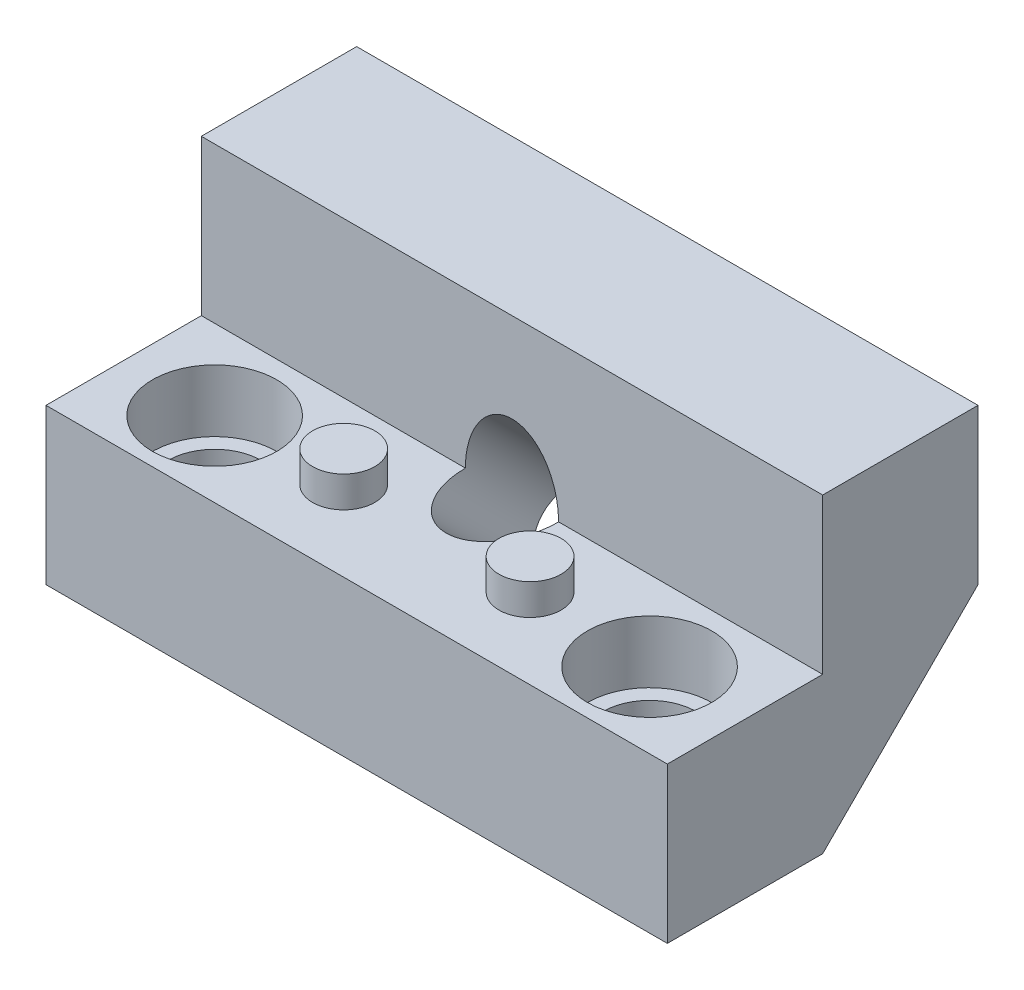
ISO-10303-21;
HEADER;
FILE_DESCRIPTION(('STEP AP214'),'2;1');
FILE_NAME('part.step','',(''),(''),'','','');
FILE_SCHEMA(('AUTOMOTIVE_DESIGN { 1 0 10303 214 1 1 1 1 }'));
ENDSEC;
DATA;
#1=APPLICATION_CONTEXT('core data for automotive mechanical design processes');
#2=APPLICATION_PROTOCOL_DEFINITION('international standard','automotive_design',2000,#1);
#3=PRODUCT_CONTEXT('',#1,'mechanical');
#4=PRODUCT('Part','Part','',(#3));
#5=PRODUCT_RELATED_PRODUCT_CATEGORY('part','',(#4));
#6=PRODUCT_DEFINITION_FORMATION('','',#4);
#7=PRODUCT_DEFINITION_CONTEXT('part definition',#1,'design');
#8=PRODUCT_DEFINITION('design','',#6,#7);
#9=PRODUCT_DEFINITION_SHAPE('','',#8);
#10=(LENGTH_UNIT() NAMED_UNIT(*) SI_UNIT(.MILLI.,.METRE.));
#11=(NAMED_UNIT(*) PLANE_ANGLE_UNIT() SI_UNIT($,.RADIAN.));
#12=(NAMED_UNIT(*) SI_UNIT($,.STERADIAN.) SOLID_ANGLE_UNIT());
#13=UNCERTAINTY_MEASURE_WITH_UNIT(LENGTH_MEASURE(1.E-05),#10,'distance_accuracy_value','');
#14=(GEOMETRIC_REPRESENTATION_CONTEXT(3) GLOBAL_UNCERTAINTY_ASSIGNED_CONTEXT((#13)) GLOBAL_UNIT_ASSIGNED_CONTEXT((#10,
#11,#12)) REPRESENTATION_CONTEXT('',''));
#15=CARTESIAN_POINT('',(0.,0.,0.));
#16=DIRECTION('',(0.,0.,1.));
#17=DIRECTION('',(1.,0.,0.));
#18=AXIS2_PLACEMENT_3D('',#15,#16,#17);
#19=CARTESIAN_POINT('',(-127.,127.,-63.5));
#20=DIRECTION('',(0.,0.,-1.));
#21=DIRECTION('',(-1.,0.,0.));
#22=AXIS2_PLACEMENT_3D('',#19,#20,#21);
#23=PLANE('',#22);
#24=DIRECTION('',(0.,-1.,0.));
#25=VECTOR('',#24,1.);
#26=CARTESIAN_POINT('',(127.,127.,-63.5));
#27=LINE('',#26,#25);
#28=CARTESIAN_POINT('',(127.,127.,-63.5));
#29=VERTEX_POINT('',#28);
#30=CARTESIAN_POINT('',(127.,63.5,-63.5));
#31=VERTEX_POINT('',#30);
#32=EDGE_CURVE('E136',#29,#31,#27,.T.);
#33=ORIENTED_EDGE('',*,*,#32,.T.);
#34=DIRECTION('',(-1.,0.,0.));
#35=VECTOR('',#34,1.);
#36=CARTESIAN_POINT('',(833.35649666683,63.5,-63.5));
#37=LINE('',#36,#35);
#38=CARTESIAN_POINT('',(-127.,63.5,-63.5));
#39=VERTEX_POINT('',#38);
#40=EDGE_CURVE('E54',#31,#39,#37,.T.);
#41=ORIENTED_EDGE('',*,*,#40,.T.);
#42=DIRECTION('',(0.,-1.,0.));
#43=VECTOR('',#42,1.);
#44=CARTESIAN_POINT('',(-127.,127.,-63.5));
#45=LINE('',#44,#43);
#46=CARTESIAN_POINT('',(-127.,127.,-63.5));
#47=VERTEX_POINT('',#46);
#48=EDGE_CURVE('E144',#47,#39,#45,.T.);
#49=ORIENTED_EDGE('',*,*,#48,.F.);
#50=DIRECTION('',(1.,0.,0.));
#51=VECTOR('',#50,1.);
#52=CARTESIAN_POINT('',(-127.,127.,-63.5));
#53=LINE('',#52,#51);
#54=EDGE_CURVE('E128',#47,#29,#53,.T.);
#55=ORIENTED_EDGE('',*,*,#54,.T.);
#56=EDGE_LOOP('',(#33,#41,#49,#55));
#57=FACE_BOUND('',#56,.T.);
#58=ADVANCED_FACE('F33',(#57),#23,.T.);
#59=CARTESIAN_POINT('',(0.,0.,0.));
#60=DIRECTION('',(0.,1.,0.));
#61=DIRECTION('',(0.,0.,1.));
#62=AXIS2_PLACEMENT_3D('',#59,#60,#61);
#63=PLANE('',#62);
#64=CARTESIAN_POINT('',(-88.9000000000001,0.,32.6581183731783));
#65=DIRECTION('',(0.,1.,0.));
#66=DIRECTION('',(0.,0.,1.));
#67=AXIS2_PLACEMENT_3D('',#64,#65,#66);
#68=CIRCLE('',#67,19.05);
#69=CARTESIAN_POINT('',(-88.9000000000001,0.,51.7081183731783));
#70=VERTEX_POINT('',#69);
#71=EDGE_CURVE('E179',#70,#70,#68,.T.);
#72=ORIENTED_EDGE('',*,*,#71,.T.);
#73=EDGE_LOOP('',(#72));
#74=FACE_BOUND('',#73,.T.);
#75=CARTESIAN_POINT('',(88.9,0.,32.6581183731783));
#76=DIRECTION('',(0.,1.,0.));
#77=DIRECTION('',(0.,0.,1.));
#78=AXIS2_PLACEMENT_3D('',#75,#76,#77);
#79=CIRCLE('',#78,19.05);
#80=CARTESIAN_POINT('',(88.9,0.,51.7081183731783));
#81=VERTEX_POINT('',#80);
#82=EDGE_CURVE('E187',#81,#81,#79,.T.);
#83=ORIENTED_EDGE('',*,*,#82,.T.);
#84=EDGE_LOOP('',(#83));
#85=FACE_BOUND('',#84,.T.);
#86=DIRECTION('',(-1.,0.,0.));
#87=VECTOR('',#86,1.);
#88=CARTESIAN_POINT('',(833.35649666683,0.,0.));
#89=LINE('',#88,#87);
#90=CARTESIAN_POINT('',(127.,0.,0.));
#91=VERTEX_POINT('',#90);
#92=CARTESIAN_POINT('',(-127.,0.,0.));
#93=VERTEX_POINT('',#92);
#94=EDGE_CURVE('E170',#91,#93,#89,.T.);
#95=ORIENTED_EDGE('',*,*,#94,.F.);
#96=DIRECTION('',(0.,0.,-1.));
#97=VECTOR('',#96,1.);
#98=CARTESIAN_POINT('',(127.,0.,63.5));
#99=LINE('',#98,#97);
#100=CARTESIAN_POINT('',(127.,0.,63.5));
#101=VERTEX_POINT('',#100);
#102=EDGE_CURVE('E127',#101,#91,#99,.T.);
#103=ORIENTED_EDGE('',*,*,#102,.F.);
#104=DIRECTION('',(1.,0.,0.));
#105=VECTOR('',#104,1.);
#106=CARTESIAN_POINT('',(-127.,0.,63.5));
#107=LINE('',#106,#105);
#108=CARTESIAN_POINT('',(-127.,0.,63.5));
#109=VERTEX_POINT('',#108);
#110=EDGE_CURVE('E139',#109,#101,#107,.T.);
#111=ORIENTED_EDGE('',*,*,#110,.F.);
#112=DIRECTION('',(0.,0.,-1.));
#113=VECTOR('',#112,1.);
#114=CARTESIAN_POINT('',(-127.,0.,63.5));
#115=LINE('',#114,#113);
#116=EDGE_CURVE('E132',#109,#93,#115,.T.);
#117=ORIENTED_EDGE('',*,*,#116,.T.);
#118=EDGE_LOOP('',(#95,#103,#111,#117));
#119=FACE_BOUND('',#118,.T.);
#120=ADVANCED_FACE('F222',(#74,#85,#119),#63,.F.);
#121=CARTESIAN_POINT('',(-127.,127.,63.5));
#122=DIRECTION('',(-1.,0.,0.));
#123=DIRECTION('',(0.,0.,1.));
#124=AXIS2_PLACEMENT_3D('',#121,#122,#123);
#125=PLANE('',#124);
#126=DIRECTION('',(0.,0.707106781186548,-0.707106781186547));
#127=VECTOR('',#126,1.);
#128=CARTESIAN_POINT('',(-127.,31.75,-31.75));
#129=LINE('',#128,#127);
#130=EDGE_CURVE('E116',#93,#39,#129,.T.);
#131=ORIENTED_EDGE('',*,*,#130,.F.);
#132=ORIENTED_EDGE('',*,*,#116,.F.);
#133=DIRECTION('',(0.,-1.,0.));
#134=VECTOR('',#133,1.);
#135=CARTESIAN_POINT('',(-127.,127.,63.5));
#136=LINE('',#135,#134);
#137=CARTESIAN_POINT('',(-127.,63.5,63.5));
#138=VERTEX_POINT('',#137);
#139=EDGE_CURVE('E148',#138,#109,#136,.T.);
#140=ORIENTED_EDGE('',*,*,#139,.F.);
#141=DIRECTION('',(0.,0.,-1.));
#142=VECTOR('',#141,1.);
#143=CARTESIAN_POINT('',(-127.,63.5,63.5));
#144=LINE('',#143,#142);
#145=CARTESIAN_POINT('',(-127.,63.5,0.));
#146=VERTEX_POINT('',#145);
#147=EDGE_CURVE('E125',#138,#146,#144,.T.);
#148=ORIENTED_EDGE('',*,*,#147,.T.);
#149=DIRECTION('',(0.,1.,0.));
#150=VECTOR('',#149,1.);
#151=CARTESIAN_POINT('',(-127.,127.,0.));
#152=LINE('',#151,#150);
#153=CARTESIAN_POINT('',(-127.,127.,0.));
#154=VERTEX_POINT('',#153);
#155=EDGE_CURVE('E115',#146,#154,#152,.T.);
#156=ORIENTED_EDGE('',*,*,#155,.T.);
#157=DIRECTION('',(0.,0.,-1.));
#158=VECTOR('',#157,1.);
#159=CARTESIAN_POINT('',(-127.,127.,63.5));
#160=LINE('',#159,#158);
#161=EDGE_CURVE('E134',#154,#47,#160,.T.);
#162=ORIENTED_EDGE('',*,*,#161,.T.);
#163=ORIENTED_EDGE('',*,*,#48,.T.);
#164=EDGE_LOOP('',(#131,#132,#140,#148,#156,#162,#163));
#165=FACE_BOUND('',#164,.T.);
#166=ADVANCED_FACE('F168',(#165),#125,.T.);
#167=CARTESIAN_POINT('',(127.,127.,63.5));
#168=DIRECTION('',(-1.,0.,0.));
#169=DIRECTION('',(0.,0.,1.));
#170=AXIS2_PLACEMENT_3D('',#167,#168,#169);
#171=PLANE('',#170);
#172=ORIENTED_EDGE('',*,*,#102,.T.);
#173=DIRECTION('',(0.,0.707106781186548,-0.707106781186547));
#174=VECTOR('',#173,1.);
#175=CARTESIAN_POINT('',(127.,31.75,-31.75));
#176=LINE('',#175,#174);
#177=EDGE_CURVE('E11',#91,#31,#176,.T.);
#178=ORIENTED_EDGE('',*,*,#177,.T.);
#179=ORIENTED_EDGE('',*,*,#32,.F.);
#180=DIRECTION('',(0.,0.,-1.));
#181=VECTOR('',#180,1.);
#182=CARTESIAN_POINT('',(127.,127.,63.5));
#183=LINE('',#182,#181);
#184=CARTESIAN_POINT('',(127.,127.,0.));
#185=VERTEX_POINT('',#184);
#186=EDGE_CURVE('E131',#185,#29,#183,.T.);
#187=ORIENTED_EDGE('',*,*,#186,.F.);
#188=DIRECTION('',(0.,1.,0.));
#189=VECTOR('',#188,1.);
#190=CARTESIAN_POINT('',(127.,127.,0.));
#191=LINE('',#190,#189);
#192=CARTESIAN_POINT('',(127.,63.5,0.));
#193=VERTEX_POINT('',#192);
#194=EDGE_CURVE('E147',#193,#185,#191,.T.);
#195=ORIENTED_EDGE('',*,*,#194,.F.);
#196=DIRECTION('',(0.,0.,-1.));
#197=VECTOR('',#196,1.);
#198=CARTESIAN_POINT('',(127.,63.5,63.5));
#199=LINE('',#198,#197);
#200=CARTESIAN_POINT('',(127.,63.5,63.5));
#201=VERTEX_POINT('',#200);
#202=EDGE_CURVE('E40',#201,#193,#199,.T.);
#203=ORIENTED_EDGE('',*,*,#202,.F.);
#204=DIRECTION('',(0.,-1.,0.));
#205=VECTOR('',#204,1.);
#206=CARTESIAN_POINT('',(127.,127.,63.5));
#207=LINE('',#206,#205);
#208=EDGE_CURVE('E150',#201,#101,#207,.T.);
#209=ORIENTED_EDGE('',*,*,#208,.T.);
#210=EDGE_LOOP('',(#172,#178,#179,#187,#195,#203,#209));
#211=FACE_BOUND('',#210,.T.);
#212=ADVANCED_FACE('F159',(#211),#171,.F.);
#213=CARTESIAN_POINT('',(-127.,127.,63.5));
#214=DIRECTION('',(0.,0.,-1.));
#215=DIRECTION('',(-1.,0.,0.));
#216=AXIS2_PLACEMENT_3D('',#213,#214,#215);
#217=PLANE('',#216);
#218=ORIENTED_EDGE('',*,*,#208,.F.);
#219=DIRECTION('',(-1.,0.,0.));
#220=VECTOR('',#219,1.);
#221=CARTESIAN_POINT('',(833.356496666829,63.5,63.5));
#222=LINE('',#221,#220);
#223=EDGE_CURVE('E122',#201,#138,#222,.T.);
#224=ORIENTED_EDGE('',*,*,#223,.T.);
#225=ORIENTED_EDGE('',*,*,#139,.T.);
#226=ORIENTED_EDGE('',*,*,#110,.T.);
#227=EDGE_LOOP('',(#218,#224,#225,#226));
#228=FACE_BOUND('',#227,.T.);
#229=ADVANCED_FACE('F224',(#228),#217,.F.);
#230=CARTESIAN_POINT('',(0.,127.,0.));
#231=DIRECTION('',(0.,1.,0.));
#232=DIRECTION('',(0.,0.,1.));
#233=AXIS2_PLACEMENT_3D('',#230,#231,#232);
#234=PLANE('',#233);
#235=DIRECTION('',(-1.,0.,0.));
#236=VECTOR('',#235,1.);
#237=CARTESIAN_POINT('',(833.356496666829,127.,0.));
#238=LINE('',#237,#236);
#239=EDGE_CURVE('E118',#185,#154,#238,.T.);
#240=ORIENTED_EDGE('',*,*,#239,.F.);
#241=ORIENTED_EDGE('',*,*,#186,.T.);
#242=ORIENTED_EDGE('',*,*,#54,.F.);
#243=ORIENTED_EDGE('',*,*,#161,.F.);
#244=EDGE_LOOP('',(#240,#241,#242,#243));
#245=FACE_BOUND('',#244,.T.);
#246=ADVANCED_FACE('F164',(#245),#234,.T.);
#247=CARTESIAN_POINT('',(833.356496666829,63.5,63.5));
#248=DIRECTION('',(0.,1.,0.));
#249=DIRECTION('',(0.,0.,1.));
#250=AXIS2_PLACEMENT_3D('',#247,#248,#249);
#251=PLANE('',#250);
#252=CARTESIAN_POINT('',(0.,63.5,0.));
#253=DIRECTION('',(0.,1.,0.));
#254=DIRECTION('',(0.,0.,-1.));
#255=AXIS2_PLACEMENT_3D('',#252,#253,#254);
#256=ELLIPSE('',#255,26.9407683632075,19.05);
#257=CARTESIAN_POINT('',(-19.05,63.5,0.));
#258=VERTEX_POINT('',#257);
#259=CARTESIAN_POINT('',(19.05,63.5,0.));
#260=VERTEX_POINT('',#259);
#261=EDGE_CURVE('E46',#258,#260,#256,.T.);
#262=ORIENTED_EDGE('',*,*,#261,.F.);
#263=DIRECTION('',(-1.,0.,0.));
#264=VECTOR('',#263,1.);
#265=CARTESIAN_POINT('',(833.356496666829,63.5,0.));
#266=LINE('',#265,#264);
#267=EDGE_CURVE('E106',#258,#146,#266,.T.);
#268=ORIENTED_EDGE('',*,*,#267,.T.);
#269=ORIENTED_EDGE('',*,*,#147,.F.);
#270=ORIENTED_EDGE('',*,*,#223,.F.);
#271=ORIENTED_EDGE('',*,*,#202,.T.);
#272=EDGE_CURVE('E109',#193,#260,#266,.T.);
#273=ORIENTED_EDGE('',*,*,#272,.T.);
#274=EDGE_LOOP('',(#262,#268,#269,#270,#271,#273));
#275=FACE_BOUND('',#274,.T.);
#276=CARTESIAN_POINT('',(38.1,63.5,30.71024923975));
#277=DIRECTION('',(0.,1.,0.));
#278=DIRECTION('',(0.,0.,1.));
#279=AXIS2_PLACEMENT_3D('',#276,#277,#278);
#280=CIRCLE('',#279,12.7);
#281=CARTESIAN_POINT('',(38.1,63.5,43.4102492397501));
#282=VERTEX_POINT('',#281);
#283=EDGE_CURVE('E110',#282,#282,#280,.T.);
#284=ORIENTED_EDGE('',*,*,#283,.F.);
#285=EDGE_LOOP('',(#284));
#286=FACE_BOUND('',#285,.T.);
#287=CARTESIAN_POINT('',(-38.1,63.5,30.71024923975));
#288=DIRECTION('',(0.,1.,0.));
#289=DIRECTION('',(0.,0.,1.));
#290=AXIS2_PLACEMENT_3D('',#287,#288,#289);
#291=CIRCLE('',#290,12.7);
#292=CARTESIAN_POINT('',(-38.1,63.5,43.4102492397501));
#293=VERTEX_POINT('',#292);
#294=EDGE_CURVE('E199',#293,#293,#291,.T.);
#295=ORIENTED_EDGE('',*,*,#294,.F.);
#296=EDGE_LOOP('',(#295));
#297=FACE_BOUND('',#296,.T.);
#298=CARTESIAN_POINT('',(-88.9000000000001,63.5,32.6581183731783));
#299=DIRECTION('',(0.,1.,0.));
#300=DIRECTION('',(0.,0.,1.));
#301=AXIS2_PLACEMENT_3D('',#298,#299,#300);
#302=CIRCLE('',#301,25.4);
#303=CARTESIAN_POINT('',(-88.9000000000001,63.5,58.0581183731783));
#304=VERTEX_POINT('',#303);
#305=EDGE_CURVE('E182',#304,#304,#302,.T.);
#306=ORIENTED_EDGE('',*,*,#305,.F.);
#307=EDGE_LOOP('',(#306));
#308=FACE_BOUND('',#307,.T.);
#309=CARTESIAN_POINT('',(88.9,63.5,32.6581183731783));
#310=DIRECTION('',(0.,1.,0.));
#311=DIRECTION('',(0.,0.,1.));
#312=AXIS2_PLACEMENT_3D('',#309,#310,#311);
#313=CIRCLE('',#312,25.4);
#314=CARTESIAN_POINT('',(88.9,63.5,58.0581183731783));
#315=VERTEX_POINT('',#314);
#316=EDGE_CURVE('E175',#315,#315,#313,.T.);
#317=ORIENTED_EDGE('',*,*,#316,.F.);
#318=EDGE_LOOP('',(#317));
#319=FACE_BOUND('',#318,.T.);
#320=ADVANCED_FACE('F103',(#275,#286,#297,#308,#319),#251,.T.);
#321=CARTESIAN_POINT('',(833.356496666829,63.5,0.));
#322=DIRECTION('',(0.,0.,1.));
#323=DIRECTION('',(0.,-1.,0.));
#324=AXIS2_PLACEMENT_3D('',#321,#322,#323);
#325=PLANE('',#324);
#326=CARTESIAN_POINT('',(0.,63.5,0.));
#327=DIRECTION('',(0.,0.,1.));
#328=DIRECTION('',(0.,-1.,0.));
#329=AXIS2_PLACEMENT_3D('',#326,#327,#328);
#330=ELLIPSE('',#329,26.9407683632075,19.05);
#331=EDGE_CURVE('E93',#260,#258,#330,.T.);
#332=ORIENTED_EDGE('',*,*,#331,.F.);
#333=ORIENTED_EDGE('',*,*,#272,.F.);
#334=ORIENTED_EDGE('',*,*,#194,.T.);
#335=ORIENTED_EDGE('',*,*,#239,.T.);
#336=ORIENTED_EDGE('',*,*,#155,.F.);
#337=ORIENTED_EDGE('',*,*,#267,.F.);
#338=EDGE_LOOP('',(#332,#333,#334,#335,#336,#337));
#339=FACE_BOUND('',#338,.T.);
#340=ADVANCED_FACE('F113',(#339),#325,.T.);
#341=CARTESIAN_POINT('',(833.35649666683,0.,0.));
#342=DIRECTION('',(0.,0.707106781186548,0.707106781186548));
#343=DIRECTION('',(0.,-0.707106781186548,0.707106781186547));
#344=AXIS2_PLACEMENT_3D('',#341,#342,#343);
#345=PLANE('',#344);
#346=CARTESIAN_POINT('',(0.,31.75,-31.75));
#347=DIRECTION('',(0.,-0.707106781186547,-0.707106781186548));
#348=DIRECTION('',(0.,0.707106781186548,-0.707106781186547));
#349=AXIS2_PLACEMENT_3D('',#346,#347,#348);
#350=CIRCLE('',#349,19.05);
#351=CARTESIAN_POINT('',(0.,45.2203841816037,-45.2203841816037));
#352=VERTEX_POINT('',#351);
#353=EDGE_CURVE('E100',#352,#352,#350,.T.);
#354=ORIENTED_EDGE('',*,*,#353,.F.);
#355=EDGE_LOOP('',(#354));
#356=FACE_BOUND('',#355,.T.);
#357=ORIENTED_EDGE('',*,*,#94,.T.);
#358=ORIENTED_EDGE('',*,*,#130,.T.);
#359=ORIENTED_EDGE('',*,*,#40,.F.);
#360=ORIENTED_EDGE('',*,*,#177,.F.);
#361=EDGE_LOOP('',(#357,#358,#359,#360));
#362=FACE_BOUND('',#361,.T.);
#363=ADVANCED_FACE('F212',(#356,#362),#345,.F.);
#364=CARTESIAN_POINT('',(88.9,38.1,32.6581183731783));
#365=DIRECTION('',(0.,1.,0.));
#366=DIRECTION('',(0.,0.,1.));
#367=AXIS2_PLACEMENT_3D('',#364,#365,#366);
#368=CYLINDRICAL_SURFACE('',#367,25.4);
#369=CARTESIAN_POINT('',(88.9,38.1,32.6581183731783));
#370=DIRECTION('',(0.,1.,0.));
#371=DIRECTION('',(0.,0.,1.));
#372=AXIS2_PLACEMENT_3D('',#369,#370,#371);
#373=CIRCLE('',#372,25.4);
#374=CARTESIAN_POINT('',(88.9,38.1,58.0581183731783));
#375=VERTEX_POINT('',#374);
#376=EDGE_CURVE('E178',#375,#375,#373,.T.);
#377=ORIENTED_EDGE('',*,*,#376,.F.);
#378=EDGE_LOOP('',(#377));
#379=FACE_BOUND('',#378,.T.);
#380=ORIENTED_EDGE('',*,*,#316,.T.);
#381=EDGE_LOOP('',(#380));
#382=FACE_BOUND('',#381,.T.);
#383=ADVANCED_FACE('F214',(#379,#382),#368,.F.);
#384=CARTESIAN_POINT('',(88.9,38.1,32.6581183731783));
#385=DIRECTION('',(0.,1.,0.));
#386=DIRECTION('',(0.,0.,1.));
#387=AXIS2_PLACEMENT_3D('',#384,#385,#386);
#388=PLANE('',#387);
#389=CARTESIAN_POINT('',(88.9,38.1,32.6581183731783));
#390=DIRECTION('',(0.,1.,0.));
#391=DIRECTION('',(0.,0.,1.));
#392=AXIS2_PLACEMENT_3D('',#389,#390,#391);
#393=CIRCLE('',#392,19.05);
#394=CARTESIAN_POINT('',(88.9,38.1,51.7081183731783));
#395=VERTEX_POINT('',#394);
#396=EDGE_CURVE('E190',#395,#395,#393,.T.);
#397=ORIENTED_EDGE('',*,*,#396,.F.);
#398=EDGE_LOOP('',(#397));
#399=FACE_BOUND('',#398,.T.);
#400=ORIENTED_EDGE('',*,*,#376,.T.);
#401=EDGE_LOOP('',(#400));
#402=FACE_BOUND('',#401,.T.);
#403=ADVANCED_FACE('F250',(#399,#402),#388,.T.);
#404=CARTESIAN_POINT('',(-88.9000000000001,38.1,32.6581183731783));
#405=DIRECTION('',(0.,1.,0.));
#406=DIRECTION('',(0.,0.,1.));
#407=AXIS2_PLACEMENT_3D('',#404,#405,#406);
#408=CYLINDRICAL_SURFACE('',#407,25.4);
#409=CARTESIAN_POINT('',(-88.9000000000001,38.1,32.6581183731783));
#410=DIRECTION('',(0.,1.,0.));
#411=DIRECTION('',(0.,0.,1.));
#412=AXIS2_PLACEMENT_3D('',#409,#410,#411);
#413=CIRCLE('',#412,25.4);
#414=CARTESIAN_POINT('',(-88.9000000000001,38.1,58.0581183731783));
#415=VERTEX_POINT('',#414);
#416=EDGE_CURVE('E172',#415,#415,#413,.T.);
#417=ORIENTED_EDGE('',*,*,#416,.F.);
#418=EDGE_LOOP('',(#417));
#419=FACE_BOUND('',#418,.T.);
#420=ORIENTED_EDGE('',*,*,#305,.T.);
#421=EDGE_LOOP('',(#420));
#422=FACE_BOUND('',#421,.T.);
#423=ADVANCED_FACE('F254',(#419,#422),#408,.F.);
#424=CARTESIAN_POINT('',(-88.9000000000001,38.1,32.6581183731783));
#425=DIRECTION('',(0.,1.,0.));
#426=DIRECTION('',(0.,0.,1.));
#427=AXIS2_PLACEMENT_3D('',#424,#425,#426);
#428=PLANE('',#427);
#429=CARTESIAN_POINT('',(-88.9000000000001,38.1,32.6581183731783));
#430=DIRECTION('',(0.,1.,0.));
#431=DIRECTION('',(0.,0.,1.));
#432=AXIS2_PLACEMENT_3D('',#429,#430,#431);
#433=CIRCLE('',#432,19.05);
#434=CARTESIAN_POINT('',(-88.9000000000001,38.1,51.7081183731783));
#435=VERTEX_POINT('',#434);
#436=EDGE_CURVE('E194',#435,#435,#433,.T.);
#437=ORIENTED_EDGE('',*,*,#436,.F.);
#438=EDGE_LOOP('',(#437));
#439=FACE_BOUND('',#438,.T.);
#440=ORIENTED_EDGE('',*,*,#416,.T.);
#441=EDGE_LOOP('',(#440));
#442=FACE_BOUND('',#441,.T.);
#443=ADVANCED_FACE('F258',(#439,#442),#428,.T.);
#444=CARTESIAN_POINT('',(88.9,0.,32.6581183731783));
#445=DIRECTION('',(0.,1.,0.));
#446=DIRECTION('',(0.,0.,1.));
#447=AXIS2_PLACEMENT_3D('',#444,#445,#446);
#448=CYLINDRICAL_SURFACE('',#447,19.05);
#449=CARTESIAN_POINT('',(88.9,0.,51.7081183731783));
#450=CARTESIAN_POINT('',(88.9,0.396875,51.7081183731783));
#451=CARTESIAN_POINT('',(88.9,0.79375,51.7081183731783));
#452=CARTESIAN_POINT('',(88.9,1.5875,51.7081183731783));
#453=CARTESIAN_POINT('',(88.9,1.984375,51.7081183731783));
#454=CARTESIAN_POINT('',(88.9,2.778125,51.7081183731783));
#455=CARTESIAN_POINT('',(88.9,3.175,51.7081183731783));
#456=CARTESIAN_POINT('',(88.9,3.96875,51.7081183731783));
#457=CARTESIAN_POINT('',(88.9,4.365625,51.7081183731783));
#458=CARTESIAN_POINT('',(88.9,5.159375,51.7081183731783));
#459=CARTESIAN_POINT('',(88.9,5.55625,51.7081183731783));
#460=CARTESIAN_POINT('',(88.9,6.35,51.7081183731783));
#461=CARTESIAN_POINT('',(88.9,6.746875,51.7081183731783));
#462=CARTESIAN_POINT('',(88.9,7.540625,51.7081183731783));
#463=CARTESIAN_POINT('',(88.9,7.9375,51.7081183731783));
#464=CARTESIAN_POINT('',(88.9,8.73125,51.7081183731783));
#465=CARTESIAN_POINT('',(88.9,9.128125,51.7081183731783));
#466=CARTESIAN_POINT('',(88.9,9.921875,51.7081183731783));
#467=CARTESIAN_POINT('',(88.9,10.31875,51.7081183731783));
#468=CARTESIAN_POINT('',(88.9,11.1125,51.7081183731783));
#469=CARTESIAN_POINT('',(88.9,11.509375,51.7081183731783));
#470=CARTESIAN_POINT('',(88.9,12.303125,51.7081183731783));
#471=CARTESIAN_POINT('',(88.9,12.7,51.7081183731783));
#472=CARTESIAN_POINT('',(88.9,13.49375,51.7081183731783));
#473=CARTESIAN_POINT('',(88.9,13.890625,51.7081183731783));
#474=CARTESIAN_POINT('',(88.9,14.684375,51.7081183731783));
#475=CARTESIAN_POINT('',(88.9,15.08125,51.7081183731783));
#476=CARTESIAN_POINT('',(88.9,15.875,51.7081183731783));
#477=CARTESIAN_POINT('',(88.9,16.271875,51.7081183731783));
#478=CARTESIAN_POINT('',(88.9,17.065625,51.7081183731783));
#479=CARTESIAN_POINT('',(88.9,17.4625,51.7081183731783));
#480=CARTESIAN_POINT('',(88.9,18.25625,51.7081183731783));
#481=CARTESIAN_POINT('',(88.9,18.653125,51.7081183731783));
#482=CARTESIAN_POINT('',(88.9,19.446875,51.7081183731783));
#483=CARTESIAN_POINT('',(88.9,19.84375,51.7081183731783));
#484=CARTESIAN_POINT('',(88.9,20.6375,51.7081183731783));
#485=CARTESIAN_POINT('',(88.9,21.034375,51.7081183731783));
#486=CARTESIAN_POINT('',(88.9,21.828125,51.7081183731783));
#487=CARTESIAN_POINT('',(88.9,22.225,51.7081183731783));
#488=CARTESIAN_POINT('',(88.9,23.01875,51.7081183731783));
#489=CARTESIAN_POINT('',(88.9,23.415625,51.7081183731783));
#490=CARTESIAN_POINT('',(88.9,24.209375,51.7081183731783));
#491=CARTESIAN_POINT('',(88.9,24.60625,51.7081183731783));
#492=CARTESIAN_POINT('',(88.9,25.4,51.7081183731783));
#493=CARTESIAN_POINT('',(88.9,25.796875,51.7081183731783));
#494=CARTESIAN_POINT('',(88.9,26.590625,51.7081183731783));
#495=CARTESIAN_POINT('',(88.9,26.9875,51.7081183731783));
#496=CARTESIAN_POINT('',(88.9,27.78125,51.7081183731783));
#497=CARTESIAN_POINT('',(88.9,28.178125,51.7081183731783));
#498=CARTESIAN_POINT('',(88.9,28.971875,51.7081183731783));
#499=CARTESIAN_POINT('',(88.9,29.36875,51.7081183731783));
#500=CARTESIAN_POINT('',(88.9,30.1625,51.7081183731783));
#501=CARTESIAN_POINT('',(88.9,30.559375,51.7081183731783));
#502=CARTESIAN_POINT('',(88.9,31.353125,51.7081183731783));
#503=CARTESIAN_POINT('',(88.9,31.75,51.7081183731783));
#504=CARTESIAN_POINT('',(88.9,32.54375,51.7081183731783));
#505=CARTESIAN_POINT('',(88.9,32.940625,51.7081183731783));
#506=CARTESIAN_POINT('',(88.9,33.734375,51.7081183731783));
#507=CARTESIAN_POINT('',(88.9,34.13125,51.7081183731783));
#508=CARTESIAN_POINT('',(88.9,34.925,51.7081183731783));
#509=CARTESIAN_POINT('',(88.9,35.321875,51.7081183731783));
#510=CARTESIAN_POINT('',(88.9,36.115625,51.7081183731783));
#511=CARTESIAN_POINT('',(88.9,36.5125,51.7081183731783));
#512=CARTESIAN_POINT('',(88.9,37.30625,51.7081183731783));
#513=CARTESIAN_POINT('',(88.9,37.703125,51.7081183731783));
#514=CARTESIAN_POINT('',(88.9,38.1,51.7081183731783));
#515=B_SPLINE_CURVE_WITH_KNOTS('',3,(#449,#450,#451,#452,#453,#454,#455,#456,#457,#458,#459,
#460,#461,#462,#463,#464,#465,#466,#467,#468,#469,#470,#471,#472,#473,#474,#475,#476,#477,#478,
#479,#480,#481,#482,#483,#484,#485,#486,#487,#488,#489,#490,#491,#492,#493,#494,#495,#496,#497,
#498,#499,#500,#501,#502,#503,#504,#505,#506,#507,#508,#509,#510,#511,#512,#513,#514),
.UNSPECIFIED.,.F.,.F.,(4,2,2,2,2,2,2,2,2,2,2,2,2,2,2,2,2,2,2,2,2,2,2,2,2,2,2,2,2,2,2,2,4),(0.,
1.190625,2.38125,3.571875,4.7625,5.953125,7.14375,8.334375,9.525,10.715625,11.90625,13.096875,
14.2875,15.478125,16.66875,17.859375,19.05,20.240625,21.43125,22.621875,23.8125,25.003125,
26.19375,27.384375,28.575,29.765625,30.95625,32.146875,33.3375,34.528125,35.71875,36.909375,
38.1),.UNSPECIFIED.);
#516=EDGE_CURVE('BSEAM262',#81,#395,#515,.T.);
#517=ORIENTED_EDGE('',*,*,#82,.F.);
#518=ORIENTED_EDGE('',*,*,#396,.T.);
#519=ORIENTED_EDGE('',*,*,#516,.T.);
#520=ORIENTED_EDGE('',*,*,#516,.F.);
#521=EDGE_LOOP('',(#517,#519,#518,#520));
#522=FACE_BOUND('',#521,.T.);
#523=ADVANCED_FACE('F262',(#522),#448,.F.);
#524=CARTESIAN_POINT('',(-88.9000000000001,0.,32.6581183731783));
#525=DIRECTION('',(0.,1.,0.));
#526=DIRECTION('',(0.,0.,1.));
#527=AXIS2_PLACEMENT_3D('',#524,#525,#526);
#528=CYLINDRICAL_SURFACE('',#527,19.05);
#529=CARTESIAN_POINT('',(-88.9000000000001,0.,51.7081183731783));
#530=CARTESIAN_POINT('',(-88.9000000000001,0.396875,51.7081183731783));
#531=CARTESIAN_POINT('',(-88.9000000000001,0.79375,51.7081183731783));
#532=CARTESIAN_POINT('',(-88.9000000000001,1.5875,51.7081183731783));
#533=CARTESIAN_POINT('',(-88.9000000000001,1.984375,51.7081183731783));
#534=CARTESIAN_POINT('',(-88.9000000000001,2.778125,51.7081183731783));
#535=CARTESIAN_POINT('',(-88.9000000000001,3.175,51.7081183731783));
#536=CARTESIAN_POINT('',(-88.9000000000001,3.96875,51.7081183731783));
#537=CARTESIAN_POINT('',(-88.9000000000001,4.365625,51.7081183731783));
#538=CARTESIAN_POINT('',(-88.9000000000001,5.159375,51.7081183731783));
#539=CARTESIAN_POINT('',(-88.9000000000001,5.55625,51.7081183731783));
#540=CARTESIAN_POINT('',(-88.9000000000001,6.35,51.7081183731783));
#541=CARTESIAN_POINT('',(-88.9000000000001,6.746875,51.7081183731783));
#542=CARTESIAN_POINT('',(-88.9000000000001,7.540625,51.7081183731783));
#543=CARTESIAN_POINT('',(-88.9000000000001,7.9375,51.7081183731783));
#544=CARTESIAN_POINT('',(-88.9000000000001,8.73125,51.7081183731783));
#545=CARTESIAN_POINT('',(-88.9000000000001,9.128125,51.7081183731783));
#546=CARTESIAN_POINT('',(-88.9000000000001,9.921875,51.7081183731783));
#547=CARTESIAN_POINT('',(-88.9000000000001,10.31875,51.7081183731783));
#548=CARTESIAN_POINT('',(-88.9000000000001,11.1125,51.7081183731783));
#549=CARTESIAN_POINT('',(-88.9000000000001,11.509375,51.7081183731783));
#550=CARTESIAN_POINT('',(-88.9000000000001,12.303125,51.7081183731783));
#551=CARTESIAN_POINT('',(-88.9000000000001,12.7,51.7081183731783));
#552=CARTESIAN_POINT('',(-88.9000000000001,13.49375,51.7081183731783));
#553=CARTESIAN_POINT('',(-88.9000000000001,13.890625,51.7081183731783));
#554=CARTESIAN_POINT('',(-88.9000000000001,14.684375,51.7081183731783));
#555=CARTESIAN_POINT('',(-88.9000000000001,15.08125,51.7081183731783));
#556=CARTESIAN_POINT('',(-88.9000000000001,15.875,51.7081183731783));
#557=CARTESIAN_POINT('',(-88.9000000000001,16.271875,51.7081183731783));
#558=CARTESIAN_POINT('',(-88.9000000000001,17.065625,51.7081183731783));
#559=CARTESIAN_POINT('',(-88.9000000000001,17.4625,51.7081183731783));
#560=CARTESIAN_POINT('',(-88.9000000000001,18.25625,51.7081183731783));
#561=CARTESIAN_POINT('',(-88.9000000000001,18.653125,51.7081183731783));
#562=CARTESIAN_POINT('',(-88.9000000000001,19.446875,51.7081183731783));
#563=CARTESIAN_POINT('',(-88.9000000000001,19.84375,51.7081183731783));
#564=CARTESIAN_POINT('',(-88.9000000000001,20.6375,51.7081183731783));
#565=CARTESIAN_POINT('',(-88.9000000000001,21.034375,51.7081183731783));
#566=CARTESIAN_POINT('',(-88.9000000000001,21.828125,51.7081183731783));
#567=CARTESIAN_POINT('',(-88.9000000000001,22.225,51.7081183731783));
#568=CARTESIAN_POINT('',(-88.9000000000001,23.01875,51.7081183731783));
#569=CARTESIAN_POINT('',(-88.9000000000001,23.415625,51.7081183731783));
#570=CARTESIAN_POINT('',(-88.9000000000001,24.209375,51.7081183731783));
#571=CARTESIAN_POINT('',(-88.9000000000001,24.60625,51.7081183731783));
#572=CARTESIAN_POINT('',(-88.9000000000001,25.4,51.7081183731783));
#573=CARTESIAN_POINT('',(-88.9000000000001,25.796875,51.7081183731783));
#574=CARTESIAN_POINT('',(-88.9000000000001,26.590625,51.7081183731783));
#575=CARTESIAN_POINT('',(-88.9000000000001,26.9875,51.7081183731783));
#576=CARTESIAN_POINT('',(-88.9000000000001,27.78125,51.7081183731783));
#577=CARTESIAN_POINT('',(-88.9000000000001,28.178125,51.7081183731783));
#578=CARTESIAN_POINT('',(-88.9000000000001,28.971875,51.7081183731783));
#579=CARTESIAN_POINT('',(-88.9000000000001,29.36875,51.7081183731783));
#580=CARTESIAN_POINT('',(-88.9000000000001,30.1625,51.7081183731783));
#581=CARTESIAN_POINT('',(-88.9000000000001,30.559375,51.7081183731783));
#582=CARTESIAN_POINT('',(-88.9000000000001,31.353125,51.7081183731783));
#583=CARTESIAN_POINT('',(-88.9000000000001,31.75,51.7081183731783));
#584=CARTESIAN_POINT('',(-88.9000000000001,32.54375,51.7081183731783));
#585=CARTESIAN_POINT('',(-88.9000000000001,32.940625,51.7081183731783));
#586=CARTESIAN_POINT('',(-88.9000000000001,33.734375,51.7081183731783));
#587=CARTESIAN_POINT('',(-88.9000000000001,34.13125,51.7081183731783));
#588=CARTESIAN_POINT('',(-88.9000000000001,34.925,51.7081183731783));
#589=CARTESIAN_POINT('',(-88.9000000000001,35.321875,51.7081183731783));
#590=CARTESIAN_POINT('',(-88.9000000000001,36.115625,51.7081183731783));
#591=CARTESIAN_POINT('',(-88.9000000000001,36.5125,51.7081183731783));
#592=CARTESIAN_POINT('',(-88.9000000000001,37.30625,51.7081183731783));
#593=CARTESIAN_POINT('',(-88.9000000000001,37.703125,51.7081183731783));
#594=CARTESIAN_POINT('',(-88.9000000000001,38.1,51.7081183731783));
#595=B_SPLINE_CURVE_WITH_KNOTS('',3,(#529,#530,#531,#532,#533,#534,#535,#536,#537,#538,#539,
#540,#541,#542,#543,#544,#545,#546,#547,#548,#549,#550,#551,#552,#553,#554,#555,#556,#557,#558,
#559,#560,#561,#562,#563,#564,#565,#566,#567,#568,#569,#570,#571,#572,#573,#574,#575,#576,#577,
#578,#579,#580,#581,#582,#583,#584,#585,#586,#587,#588,#589,#590,#591,#592,#593,#594),
.UNSPECIFIED.,.F.,.F.,(4,2,2,2,2,2,2,2,2,2,2,2,2,2,2,2,2,2,2,2,2,2,2,2,2,2,2,2,2,2,2,2,4),(0.,
1.190625,2.38125,3.571875,4.7625,5.953125,7.14375,8.334375,9.525,10.715625,11.90625,13.096875,
14.2875,15.478125,16.66875,17.859375,19.05,20.240625,21.43125,22.621875,23.8125,25.003125,
26.19375,27.384375,28.575,29.765625,30.95625,32.146875,33.3375,34.528125,35.71875,36.909375,
38.1),.UNSPECIFIED.);
#596=EDGE_CURVE('BSEAM266',#70,#435,#595,.T.);
#597=ORIENTED_EDGE('',*,*,#71,.F.);
#598=ORIENTED_EDGE('',*,*,#436,.T.);
#599=ORIENTED_EDGE('',*,*,#596,.T.);
#600=ORIENTED_EDGE('',*,*,#596,.F.);
#601=EDGE_LOOP('',(#597,#599,#598,#600));
#602=FACE_BOUND('',#601,.T.);
#603=ADVANCED_FACE('F266',(#602),#528,.F.);
#604=CARTESIAN_POINT('',(-38.1,76.2,30.71024923975));
#605=DIRECTION('',(0.,-1.,0.));
#606=DIRECTION('',(0.,0.,-1.));
#607=AXIS2_PLACEMENT_3D('',#604,#605,#606);
#608=CYLINDRICAL_SURFACE('',#607,12.7);
#609=CARTESIAN_POINT('',(-38.1,76.2,30.71024923975));
#610=DIRECTION('',(0.,1.,0.));
#611=DIRECTION('',(0.,0.,1.));
#612=AXIS2_PLACEMENT_3D('',#609,#610,#611);
#613=CIRCLE('',#612,12.7);
#614=CARTESIAN_POINT('',(-38.1,76.2,43.4102492397501));
#615=VERTEX_POINT('',#614);
#616=EDGE_CURVE('E191',#615,#615,#613,.T.);
#617=ORIENTED_EDGE('',*,*,#616,.F.);
#618=EDGE_LOOP('',(#617));
#619=FACE_BOUND('',#618,.T.);
#620=ORIENTED_EDGE('',*,*,#294,.T.);
#621=EDGE_LOOP('',(#620));
#622=FACE_BOUND('',#621,.T.);
#623=ADVANCED_FACE('F270',(#619,#622),#608,.T.);
#624=CARTESIAN_POINT('',(-38.1,76.2,30.71024923975));
#625=DIRECTION('',(0.,1.,0.));
#626=DIRECTION('',(0.,0.,1.));
#627=AXIS2_PLACEMENT_3D('',#624,#625,#626);
#628=PLANE('',#627);
#629=ORIENTED_EDGE('',*,*,#616,.T.);
#630=EDGE_LOOP('',(#629));
#631=FACE_BOUND('',#630,.T.);
#632=ADVANCED_FACE('F274',(#631),#628,.T.);
#633=CARTESIAN_POINT('',(38.1,76.2,30.71024923975));
#634=DIRECTION('',(0.,-1.,0.));
#635=DIRECTION('',(0.,0.,-1.));
#636=AXIS2_PLACEMENT_3D('',#633,#634,#635);
#637=CYLINDRICAL_SURFACE('',#636,12.7);
#638=CARTESIAN_POINT('',(38.1,76.2,30.71024923975));
#639=DIRECTION('',(0.,1.,0.));
#640=DIRECTION('',(0.,0.,1.));
#641=AXIS2_PLACEMENT_3D('',#638,#639,#640);
#642=CIRCLE('',#641,12.7);
#643=CARTESIAN_POINT('',(38.1,76.2,43.4102492397501));
#644=VERTEX_POINT('',#643);
#645=EDGE_CURVE('E202',#644,#644,#642,.T.);
#646=ORIENTED_EDGE('',*,*,#645,.F.);
#647=EDGE_LOOP('',(#646));
#648=FACE_BOUND('',#647,.T.);
#649=ORIENTED_EDGE('',*,*,#283,.T.);
#650=EDGE_LOOP('',(#649));
#651=FACE_BOUND('',#650,.T.);
#652=ADVANCED_FACE('F278',(#648,#651),#637,.T.);
#653=CARTESIAN_POINT('',(38.1,76.2,30.71024923975));
#654=DIRECTION('',(0.,1.,0.));
#655=DIRECTION('',(0.,0.,1.));
#656=AXIS2_PLACEMENT_3D('',#653,#654,#655);
#657=PLANE('',#656);
#658=ORIENTED_EDGE('',*,*,#645,.T.);
#659=EDGE_LOOP('',(#658));
#660=FACE_BOUND('',#659,.T.);
#661=ADVANCED_FACE('F282',(#660),#657,.T.);
#662=CARTESIAN_POINT('',(0.,127.,63.5));
#663=DIRECTION('',(0.,-0.707106781186547,-0.707106781186548));
#664=DIRECTION('',(0.,0.707106781186548,-0.707106781186547));
#665=AXIS2_PLACEMENT_3D('',#662,#663,#664);
#666=CYLINDRICAL_SURFACE('',#665,19.05);
#667=ORIENTED_EDGE('',*,*,#261,.T.);
#668=ORIENTED_EDGE('',*,*,#331,.T.);
#669=EDGE_LOOP('',(#667,#668));
#670=FACE_BOUND('',#669,.T.);
#671=ORIENTED_EDGE('',*,*,#353,.T.);
#672=EDGE_LOOP('',(#671));
#673=FACE_BOUND('',#672,.T.);
#674=ADVANCED_FACE('F94',(#670,#673),#666,.F.);
#675=CLOSED_SHELL('',(#58,#120,#166,#212,#229,#246,#320,#340,#363,#383,#403,#423,#443,#523,#603,
#623,#632,#652,#661,#674));
#676=MANIFOLD_SOLID_BREP('B2',#675);
#677=ADVANCED_BREP_SHAPE_REPRESENTATION('',(#18,#676),#14);
#678=SHAPE_DEFINITION_REPRESENTATION(#9,#677);
ENDSEC;
END-ISO-10303-21;
